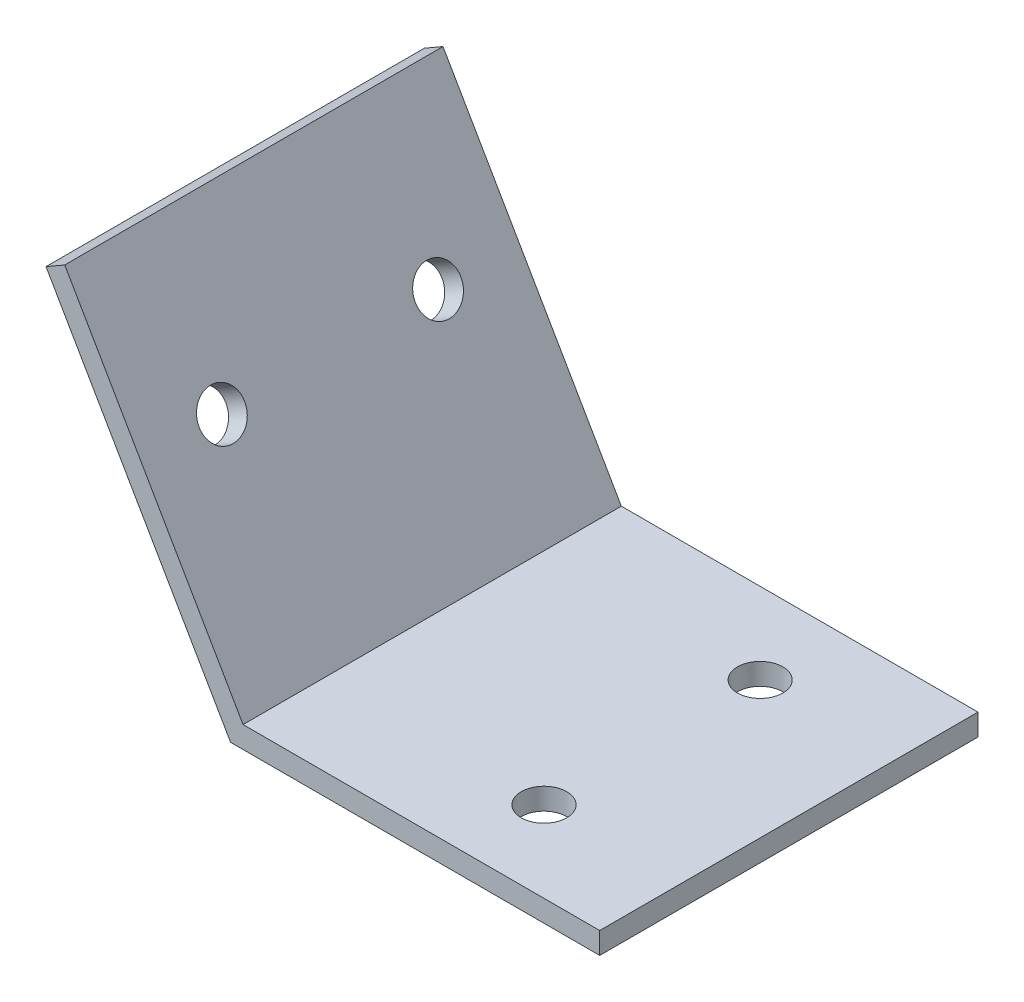
ISO-10303-21;
HEADER;
FILE_DESCRIPTION(('STEP AP214'),'2;1');
FILE_NAME('part.step','',(''),(''),'','','');
FILE_SCHEMA(('AUTOMOTIVE_DESIGN { 1 0 10303 214 1 1 1 1 }'));
ENDSEC;
DATA;
#1=APPLICATION_CONTEXT('core data for automotive mechanical design processes');
#2=APPLICATION_PROTOCOL_DEFINITION('international standard','automotive_design',2000,#1);
#3=PRODUCT_CONTEXT('',#1,'mechanical');
#4=PRODUCT('Part','Part','',(#3));
#5=PRODUCT_RELATED_PRODUCT_CATEGORY('part','',(#4));
#6=PRODUCT_DEFINITION_FORMATION('','',#4);
#7=PRODUCT_DEFINITION_CONTEXT('part definition',#1,'design');
#8=PRODUCT_DEFINITION('design','',#6,#7);
#9=PRODUCT_DEFINITION_SHAPE('','',#8);
#10=(LENGTH_UNIT() NAMED_UNIT(*) SI_UNIT(.MILLI.,.METRE.));
#11=(NAMED_UNIT(*) PLANE_ANGLE_UNIT() SI_UNIT($,.RADIAN.));
#12=(NAMED_UNIT(*) SI_UNIT($,.STERADIAN.) SOLID_ANGLE_UNIT());
#13=UNCERTAINTY_MEASURE_WITH_UNIT(LENGTH_MEASURE(1.E-05),#10,'distance_accuracy_value','');
#14=(GEOMETRIC_REPRESENTATION_CONTEXT(3) GLOBAL_UNCERTAINTY_ASSIGNED_CONTEXT((#13)) GLOBAL_UNIT_ASSIGNED_CONTEXT((#10,
#11,#12)) REPRESENTATION_CONTEXT('',''));
#15=CARTESIAN_POINT('',(0.,0.,0.));
#16=DIRECTION('',(0.,0.,1.));
#17=DIRECTION('',(1.,0.,0.));
#18=AXIS2_PLACEMENT_3D('',#15,#16,#17);
#19=CARTESIAN_POINT('',(-17.0773502691896,29.5788383248865,35.));
#20=DIRECTION('',(0.86602540378444,0.499999999999998,0.));
#21=DIRECTION('',(-0.499999999999998,0.86602540378444,0.));
#22=AXIS2_PLACEMENT_3D('',#19,#20,#21);
#23=PLANE('',#22);
#24=CARTESIAN_POINT('',(-10.035,17.3811298539537,27.5));
#25=DIRECTION('',(-0.86602540378444,-0.499999999999998,0.));
#26=DIRECTION('',(0.499999999999998,-0.86602540378444,0.));
#27=AXIS2_PLACEMENT_3D('',#24,#25,#26);
#28=CIRCLE('',#27,2.1);
#29=CARTESIAN_POINT('',(-8.98499999999996,15.5624765060064,27.5));
#30=VERTEX_POINT('',#29);
#31=EDGE_CURVE('E149',#30,#30,#28,.T.);
#32=ORIENTED_EDGE('',*,*,#31,.F.);
#33=EDGE_LOOP('',(#32));
#34=FACE_BOUND('',#33,.T.);
#35=CARTESIAN_POINT('',(-10.035,17.3811298539537,7.5));
#36=DIRECTION('',(-0.86602540378444,-0.499999999999998,0.));
#37=DIRECTION('',(-0.499999999999998,0.86602540378444,0.));
#38=AXIS2_PLACEMENT_3D('',#35,#36,#37);
#39=CIRCLE('',#38,2.1);
#40=CARTESIAN_POINT('',(-8.98499999999996,15.5624765060064,7.5));
#41=VERTEX_POINT('',#40);
#42=EDGE_CURVE('E155',#41,#41,#39,.T.);
#43=ORIENTED_EDGE('',*,*,#42,.F.);
#44=EDGE_LOOP('',(#43));
#45=FACE_BOUND('',#44,.T.);
#46=DIRECTION('',(0.499999999999998,-0.86602540378444,0.));
#47=VECTOR('',#46,1.);
#48=CARTESIAN_POINT('',(-17.0773502691896,29.5788383248865,0.));
#49=LINE('',#48,#47);
#50=CARTESIAN_POINT('',(-17.0773502691896,29.5788383248865,0.));
#51=VERTEX_POINT('',#50);
#52=CARTESIAN_POINT('',(0.,0.,0.));
#53=VERTEX_POINT('',#52);
#54=EDGE_CURVE('E125',#51,#53,#49,.T.);
#55=ORIENTED_EDGE('',*,*,#54,.T.);
#56=DIRECTION('',(0.,0.,-1.));
#57=VECTOR('',#56,1.);
#58=CARTESIAN_POINT('',(0.,0.,35.));
#59=LINE('',#58,#57);
#60=CARTESIAN_POINT('',(0.,0.,35.));
#61=VERTEX_POINT('',#60);
#62=EDGE_CURVE('E11',#61,#53,#59,.T.);
#63=ORIENTED_EDGE('',*,*,#62,.F.);
#64=DIRECTION('',(0.499999999999998,-0.86602540378444,0.));
#65=VECTOR('',#64,1.);
#66=CARTESIAN_POINT('',(-17.0773502691896,29.5788383248865,35.));
#67=LINE('',#66,#65);
#68=CARTESIAN_POINT('',(-17.0773502691896,29.5788383248865,35.));
#69=VERTEX_POINT('',#68);
#70=EDGE_CURVE('E136',#69,#61,#67,.T.);
#71=ORIENTED_EDGE('',*,*,#70,.F.);
#72=DIRECTION('',(0.,0.,-1.));
#73=VECTOR('',#72,1.);
#74=CARTESIAN_POINT('',(-17.0773502691896,29.5788383248865,35.));
#75=LINE('',#74,#73);
#76=EDGE_CURVE('E121',#69,#51,#75,.T.);
#77=ORIENTED_EDGE('',*,*,#76,.T.);
#78=EDGE_LOOP('',(#55,#63,#71,#77));
#79=FACE_BOUND('',#78,.T.);
#80=ADVANCED_FACE('F39',(#34,#45,#79),#23,.F.);
#81=CARTESIAN_POINT('',(0.,0.,35.));
#82=DIRECTION('',(0.,1.,0.));
#83=DIRECTION('',(-1.,0.,0.));
#84=AXIS2_PLACEMENT_3D('',#81,#82,#83);
#85=PLANE('',#84);
#86=CARTESIAN_POINT('',(21.5,0.,27.5));
#87=DIRECTION('',(0.,-1.,0.));
#88=DIRECTION('',(1.,0.,0.));
#89=AXIS2_PLACEMENT_3D('',#86,#87,#88);
#90=CIRCLE('',#89,2.1);
#91=CARTESIAN_POINT('',(23.6,0.,27.5));
#92=VERTEX_POINT('',#91);
#93=EDGE_CURVE('E145',#92,#92,#90,.T.);
#94=ORIENTED_EDGE('',*,*,#93,.F.);
#95=EDGE_LOOP('',(#94));
#96=FACE_BOUND('',#95,.T.);
#97=CARTESIAN_POINT('',(21.5,0.,7.50000000000001));
#98=DIRECTION('',(0.,-1.,0.));
#99=DIRECTION('',(-1.,0.,0.));
#100=AXIS2_PLACEMENT_3D('',#97,#98,#99);
#101=CIRCLE('',#100,2.1);
#102=CARTESIAN_POINT('',(19.4,0.,7.50000000000001));
#103=VERTEX_POINT('',#102);
#104=EDGE_CURVE('E153',#103,#103,#101,.T.);
#105=ORIENTED_EDGE('',*,*,#104,.F.);
#106=EDGE_LOOP('',(#105));
#107=FACE_BOUND('',#106,.T.);
#108=DIRECTION('',(1.,0.,0.));
#109=VECTOR('',#108,1.);
#110=CARTESIAN_POINT('',(0.,0.,0.));
#111=LINE('',#110,#109);
#112=CARTESIAN_POINT('',(34.1547005383792,0.,0.));
#113=VERTEX_POINT('',#112);
#114=EDGE_CURVE('E128',#53,#113,#111,.T.);
#115=ORIENTED_EDGE('',*,*,#114,.T.);
#116=DIRECTION('',(0.,0.,-1.));
#117=VECTOR('',#116,1.);
#118=CARTESIAN_POINT('',(34.1547005383792,0.,35.));
#119=LINE('',#118,#117);
#120=CARTESIAN_POINT('',(34.1547005383792,0.,35.));
#121=VERTEX_POINT('',#120);
#122=EDGE_CURVE('E48',#121,#113,#119,.T.);
#123=ORIENTED_EDGE('',*,*,#122,.F.);
#124=DIRECTION('',(1.,0.,0.));
#125=VECTOR('',#124,1.);
#126=CARTESIAN_POINT('',(0.,0.,35.));
#127=LINE('',#126,#125);
#128=EDGE_CURVE('E94',#61,#121,#127,.T.);
#129=ORIENTED_EDGE('',*,*,#128,.F.);
#130=ORIENTED_EDGE('',*,*,#62,.T.);
#131=EDGE_LOOP('',(#115,#123,#129,#130));
#132=FACE_BOUND('',#131,.T.);
#133=ADVANCED_FACE('F169',(#96,#107,#132),#85,.F.);
#134=CARTESIAN_POINT('',(34.1547005383792,0.,35.));
#135=DIRECTION('',(-1.,0.,0.));
#136=DIRECTION('',(0.,0.,1.));
#137=AXIS2_PLACEMENT_3D('',#134,#135,#136);
#138=PLANE('',#137);
#139=DIRECTION('',(0.,1.,0.));
#140=VECTOR('',#139,1.);
#141=CARTESIAN_POINT('',(34.1547005383792,0.,0.));
#142=LINE('',#141,#140);
#143=CARTESIAN_POINT('',(34.1547005383792,2.,0.));
#144=VERTEX_POINT('',#143);
#145=EDGE_CURVE('E131',#113,#144,#142,.T.);
#146=ORIENTED_EDGE('',*,*,#145,.T.);
#147=DIRECTION('',(0.,0.,-1.));
#148=VECTOR('',#147,1.);
#149=CARTESIAN_POINT('',(34.1547005383792,2.,35.));
#150=LINE('',#149,#148);
#151=CARTESIAN_POINT('',(34.1547005383792,2.,35.));
#152=VERTEX_POINT('',#151);
#153=EDGE_CURVE('E116',#152,#144,#150,.T.);
#154=ORIENTED_EDGE('',*,*,#153,.F.);
#155=DIRECTION('',(0.,1.,0.));
#156=VECTOR('',#155,1.);
#157=CARTESIAN_POINT('',(34.1547005383792,0.,35.));
#158=LINE('',#157,#156);
#159=EDGE_CURVE('E107',#121,#152,#158,.T.);
#160=ORIENTED_EDGE('',*,*,#159,.F.);
#161=ORIENTED_EDGE('',*,*,#122,.T.);
#162=EDGE_LOOP('',(#146,#154,#160,#161));
#163=FACE_BOUND('',#162,.T.);
#164=ADVANCED_FACE('F172',(#163),#138,.F.);
#165=CARTESIAN_POINT('',(34.1547005383792,2.,35.));
#166=DIRECTION('',(0.,-1.,0.));
#167=DIRECTION('',(1.,0.,0.));
#168=AXIS2_PLACEMENT_3D('',#165,#166,#167);
#169=PLANE('',#168);
#170=CARTESIAN_POINT('',(21.5,2.,27.5));
#171=DIRECTION('',(0.,-1.,0.));
#172=DIRECTION('',(1.,0.,0.));
#173=AXIS2_PLACEMENT_3D('',#170,#171,#172);
#174=CIRCLE('',#173,2.1);
#175=CARTESIAN_POINT('',(23.6,2.,27.5));
#176=VERTEX_POINT('',#175);
#177=EDGE_CURVE('E129',#176,#176,#174,.T.);
#178=ORIENTED_EDGE('',*,*,#177,.T.);
#179=EDGE_LOOP('',(#178));
#180=FACE_BOUND('',#179,.T.);
#181=CARTESIAN_POINT('',(21.5,2.,7.50000000000001));
#182=DIRECTION('',(0.,-1.,0.));
#183=DIRECTION('',(1.,0.,0.));
#184=AXIS2_PLACEMENT_3D('',#181,#182,#183);
#185=CIRCLE('',#184,2.1);
#186=CARTESIAN_POINT('',(23.6,2.,7.50000000000001));
#187=VERTEX_POINT('',#186);
#188=EDGE_CURVE('E142',#187,#187,#185,.T.);
#189=ORIENTED_EDGE('',*,*,#188,.T.);
#190=EDGE_LOOP('',(#189));
#191=FACE_BOUND('',#190,.T.);
#192=DIRECTION('',(-1.,0.,0.));
#193=VECTOR('',#192,1.);
#194=CARTESIAN_POINT('',(34.1547005383792,2.,0.));
#195=LINE('',#194,#193);
#196=CARTESIAN_POINT('',(1.15470053837926,2.,0.));
#197=VERTEX_POINT('',#196);
#198=EDGE_CURVE('E115',#144,#197,#195,.T.);
#199=ORIENTED_EDGE('',*,*,#198,.T.);
#200=DIRECTION('',(0.,0.,-1.));
#201=VECTOR('',#200,1.);
#202=CARTESIAN_POINT('',(1.15470053837926,2.,35.));
#203=LINE('',#202,#201);
#204=CARTESIAN_POINT('',(1.15470053837926,2.,35.));
#205=VERTEX_POINT('',#204);
#206=EDGE_CURVE('E112',#205,#197,#203,.T.);
#207=ORIENTED_EDGE('',*,*,#206,.F.);
#208=DIRECTION('',(-1.,0.,0.));
#209=VECTOR('',#208,1.);
#210=CARTESIAN_POINT('',(34.1547005383792,2.,35.));
#211=LINE('',#210,#209);
#212=EDGE_CURVE('E101',#152,#205,#211,.T.);
#213=ORIENTED_EDGE('',*,*,#212,.F.);
#214=ORIENTED_EDGE('',*,*,#153,.T.);
#215=EDGE_LOOP('',(#199,#207,#213,#214));
#216=FACE_BOUND('',#215,.T.);
#217=ADVANCED_FACE('F113',(#180,#191,#216),#169,.F.);
#218=CARTESIAN_POINT('',(1.15470053837926,2.,35.));
#219=DIRECTION('',(-0.86602540378444,-0.499999999999998,0.));
#220=DIRECTION('',(0.499999999999998,-0.86602540378444,0.));
#221=AXIS2_PLACEMENT_3D('',#218,#219,#220);
#222=PLANE('',#221);
#223=CARTESIAN_POINT('',(-8.30294919243108,18.3811298539537,27.5));
#224=DIRECTION('',(-0.86602540378444,-0.499999999999998,0.));
#225=DIRECTION('',(0.499999999999998,-0.86602540378444,0.));
#226=AXIS2_PLACEMENT_3D('',#223,#224,#225);
#227=CIRCLE('',#226,2.1);
#228=CARTESIAN_POINT('',(-7.25294919243109,16.5624765060064,27.5));
#229=VERTEX_POINT('',#228);
#230=EDGE_CURVE('E42',#229,#229,#227,.T.);
#231=ORIENTED_EDGE('',*,*,#230,.T.);
#232=EDGE_LOOP('',(#231));
#233=FACE_BOUND('',#232,.T.);
#234=CARTESIAN_POINT('',(-8.30294919243108,18.3811298539537,7.5));
#235=DIRECTION('',(-0.86602540378444,-0.499999999999998,0.));
#236=DIRECTION('',(0.499999999999998,-0.86602540378444,0.));
#237=AXIS2_PLACEMENT_3D('',#234,#235,#236);
#238=CIRCLE('',#237,2.1);
#239=CARTESIAN_POINT('',(-7.25294919243109,16.5624765060064,7.5));
#240=VERTEX_POINT('',#239);
#241=EDGE_CURVE('E147',#240,#240,#238,.T.);
#242=ORIENTED_EDGE('',*,*,#241,.T.);
#243=EDGE_LOOP('',(#242));
#244=FACE_BOUND('',#243,.T.);
#245=DIRECTION('',(-0.499999999999998,0.86602540378444,0.));
#246=VECTOR('',#245,1.);
#247=CARTESIAN_POINT('',(1.15470053837926,2.,0.));
#248=LINE('',#247,#246);
#249=CARTESIAN_POINT('',(-15.3452994616207,30.5788383248865,0.));
#250=VERTEX_POINT('',#249);
#251=EDGE_CURVE('E80',#197,#250,#248,.T.);
#252=ORIENTED_EDGE('',*,*,#251,.T.);
#253=DIRECTION('',(0.,0.,-1.));
#254=VECTOR('',#253,1.);
#255=CARTESIAN_POINT('',(-15.3452994616207,30.5788383248865,35.));
#256=LINE('',#255,#254);
#257=CARTESIAN_POINT('',(-15.3452994616207,30.5788383248865,35.));
#258=VERTEX_POINT('',#257);
#259=EDGE_CURVE('E117',#258,#250,#256,.T.);
#260=ORIENTED_EDGE('',*,*,#259,.F.);
#261=DIRECTION('',(-0.499999999999998,0.86602540378444,0.));
#262=VECTOR('',#261,1.);
#263=CARTESIAN_POINT('',(1.15470053837926,2.,35.));
#264=LINE('',#263,#262);
#265=EDGE_CURVE('E105',#205,#258,#264,.T.);
#266=ORIENTED_EDGE('',*,*,#265,.F.);
#267=ORIENTED_EDGE('',*,*,#206,.T.);
#268=EDGE_LOOP('',(#252,#260,#266,#267));
#269=FACE_BOUND('',#268,.T.);
#270=ADVANCED_FACE('F119',(#233,#244,#269),#222,.F.);
#271=CARTESIAN_POINT('',(-15.3452994616207,30.5788383248865,35.));
#272=DIRECTION('',(0.499999999999998,-0.86602540378444,0.));
#273=DIRECTION('',(0.86602540378444,0.499999999999998,0.));
#274=AXIS2_PLACEMENT_3D('',#271,#272,#273);
#275=PLANE('',#274);
#276=DIRECTION('',(-0.86602540378444,-0.499999999999998,0.));
#277=VECTOR('',#276,1.);
#278=CARTESIAN_POINT('',(-15.3452994616207,30.5788383248865,0.));
#279=LINE('',#278,#277);
#280=EDGE_CURVE('E86',#250,#51,#279,.T.);
#281=ORIENTED_EDGE('',*,*,#280,.T.);
#282=ORIENTED_EDGE('',*,*,#76,.F.);
#283=DIRECTION('',(-0.86602540378444,-0.499999999999998,0.));
#284=VECTOR('',#283,1.);
#285=CARTESIAN_POINT('',(-15.3452994616207,30.5788383248865,35.));
#286=LINE('',#285,#284);
#287=EDGE_CURVE('E57',#258,#69,#286,.T.);
#288=ORIENTED_EDGE('',*,*,#287,.F.);
#289=ORIENTED_EDGE('',*,*,#259,.T.);
#290=EDGE_LOOP('',(#281,#282,#288,#289));
#291=FACE_BOUND('',#290,.T.);
#292=ADVANCED_FACE('F177',(#291),#275,.F.);
#293=CARTESIAN_POINT('',(0.,0.,35.));
#294=DIRECTION('',(0.,0.,-1.));
#295=DIRECTION('',(-1.,0.,0.));
#296=AXIS2_PLACEMENT_3D('',#293,#294,#295);
#297=PLANE('',#296);
#298=ORIENTED_EDGE('',*,*,#70,.T.);
#299=ORIENTED_EDGE('',*,*,#128,.T.);
#300=ORIENTED_EDGE('',*,*,#159,.T.);
#301=ORIENTED_EDGE('',*,*,#212,.T.);
#302=ORIENTED_EDGE('',*,*,#265,.T.);
#303=ORIENTED_EDGE('',*,*,#287,.T.);
#304=EDGE_LOOP('',(#298,#299,#300,#301,#302,#303));
#305=FACE_BOUND('',#304,.T.);
#306=ADVANCED_FACE('F103',(#305),#297,.F.);
#307=CARTESIAN_POINT('',(0.,0.,0.));
#308=DIRECTION('',(0.,0.,-1.));
#309=DIRECTION('',(-1.,0.,0.));
#310=AXIS2_PLACEMENT_3D('',#307,#308,#309);
#311=PLANE('',#310);
#312=ORIENTED_EDGE('',*,*,#54,.F.);
#313=ORIENTED_EDGE('',*,*,#280,.F.);
#314=ORIENTED_EDGE('',*,*,#251,.F.);
#315=ORIENTED_EDGE('',*,*,#198,.F.);
#316=ORIENTED_EDGE('',*,*,#145,.F.);
#317=ORIENTED_EDGE('',*,*,#114,.F.);
#318=EDGE_LOOP('',(#312,#313,#314,#315,#316,#317));
#319=FACE_BOUND('',#318,.T.);
#320=ADVANCED_FACE('F175',(#319),#311,.T.);
#321=CARTESIAN_POINT('',(21.5,30.5788383248865,7.50000000000001));
#322=DIRECTION('',(0.,-1.,0.));
#323=DIRECTION('',(1.,0.,0.));
#324=AXIS2_PLACEMENT_3D('',#321,#322,#323);
#325=CYLINDRICAL_SURFACE('',#324,2.1);
#326=ORIENTED_EDGE('',*,*,#104,.T.);
#327=EDGE_LOOP('',(#326));
#328=FACE_BOUND('',#327,.T.);
#329=ORIENTED_EDGE('',*,*,#188,.F.);
#330=EDGE_LOOP('',(#329));
#331=FACE_BOUND('',#330,.T.);
#332=ADVANCED_FACE('F209',(#328,#331),#325,.F.);
#333=CARTESIAN_POINT('',(21.5,30.5788383248865,27.5));
#334=DIRECTION('',(0.,-1.,0.));
#335=DIRECTION('',(1.,0.,0.));
#336=AXIS2_PLACEMENT_3D('',#333,#334,#335);
#337=CYLINDRICAL_SURFACE('',#336,2.1);
#338=ORIENTED_EDGE('',*,*,#93,.T.);
#339=EDGE_LOOP('',(#338));
#340=FACE_BOUND('',#339,.T.);
#341=ORIENTED_EDGE('',*,*,#177,.F.);
#342=EDGE_LOOP('',(#341));
#343=FACE_BOUND('',#342,.T.);
#344=ADVANCED_FACE('F203',(#340,#343),#337,.F.);
#345=CARTESIAN_POINT('',(28.8220508075689,39.8152585976185,7.5));
#346=DIRECTION('',(-0.86602540378444,-0.499999999999998,0.));
#347=DIRECTION('',(0.499999999999998,-0.86602540378444,0.));
#348=AXIS2_PLACEMENT_3D('',#345,#346,#347);
#349=CYLINDRICAL_SURFACE('',#348,2.1);
#350=CARTESIAN_POINT('',(-8.98499999999996,15.5624765060064,7.5));
#351=CARTESIAN_POINT('',(-8.96695780408778,15.5728931726731,7.5));
#352=CARTESIAN_POINT('',(-8.94891560817561,15.5833098393397,7.5));
#353=CARTESIAN_POINT('',(-8.91283121635125,15.6041431726731,7.5));
#354=CARTESIAN_POINT('',(-8.89478902043908,15.6145598393397,7.5));
#355=CARTESIAN_POINT('',(-8.85870462861473,15.635393172673,7.5));
#356=CARTESIAN_POINT('',(-8.84066243270255,15.6458098393397,7.5));
#357=CARTESIAN_POINT('',(-8.8045780408782,15.666643172673,7.5));
#358=CARTESIAN_POINT('',(-8.78653584496602,15.6770598393397,7.5));
#359=CARTESIAN_POINT('',(-8.75045145314167,15.697893172673,7.5));
#360=CARTESIAN_POINT('',(-8.7324092572295,15.7083098393397,7.5));
#361=CARTESIAN_POINT('',(-8.69632486540514,15.729143172673,7.5));
#362=CARTESIAN_POINT('',(-8.67828266949297,15.7395598393397,7.5));
#363=CARTESIAN_POINT('',(-8.64219827766862,15.760393172673,7.5));
#364=CARTESIAN_POINT('',(-8.62415608175644,15.7708098393397,7.5));
#365=CARTESIAN_POINT('',(-8.58807168993209,15.791643172673,7.5));
#366=CARTESIAN_POINT('',(-8.57002949401991,15.8020598393397,7.5));
#367=CARTESIAN_POINT('',(-8.53394510219556,15.822893172673,7.5));
#368=CARTESIAN_POINT('',(-8.51590290628339,15.8333098393397,7.5));
#369=CARTESIAN_POINT('',(-8.47981851445904,15.854143172673,7.5));
#370=CARTESIAN_POINT('',(-8.46177631854687,15.8645598393397,7.5));
#371=CARTESIAN_POINT('',(-8.42569192672251,15.885393172673,7.5));
#372=CARTESIAN_POINT('',(-8.40764973081034,15.8958098393397,7.5));
#373=CARTESIAN_POINT('',(-8.37156533898598,15.916643172673,7.5));
#374=CARTESIAN_POINT('',(-8.35352314307381,15.9270598393397,7.5));
#375=CARTESIAN_POINT('',(-8.31743875124946,15.947893172673,7.5));
#376=CARTESIAN_POINT('',(-8.29939655533728,15.9583098393397,7.5));
#377=CARTESIAN_POINT('',(-8.26331216351293,15.979143172673,7.5));
#378=CARTESIAN_POINT('',(-8.24526996760075,15.9895598393397,7.5));
#379=CARTESIAN_POINT('',(-8.2091855757764,16.010393172673,7.5));
#380=CARTESIAN_POINT('',(-8.19114337986423,16.0208098393397,7.5));
#381=CARTESIAN_POINT('',(-8.15505898803987,16.041643172673,7.5));
#382=CARTESIAN_POINT('',(-8.1370167921277,16.0520598393397,7.5));
#383=CARTESIAN_POINT('',(-8.10093240030335,16.072893172673,7.5));
#384=CARTESIAN_POINT('',(-8.08289020439117,16.0833098393397,7.5));
#385=CARTESIAN_POINT('',(-8.04680581256682,16.104143172673,7.5));
#386=CARTESIAN_POINT('',(-8.02876361665464,16.1145598393397,7.5));
#387=CARTESIAN_POINT('',(-7.99267922483029,16.135393172673,7.5));
#388=CARTESIAN_POINT('',(-7.97463702891812,16.1458098393397,7.5));
#389=CARTESIAN_POINT('',(-7.93855263709376,16.166643172673,7.5));
#390=CARTESIAN_POINT('',(-7.92051044118159,16.1770598393397,7.5));
#391=CARTESIAN_POINT('',(-7.88442604935724,16.197893172673,7.5));
#392=CARTESIAN_POINT('',(-7.86638385344506,16.2083098393397,7.5));
#393=CARTESIAN_POINT('',(-7.83029946162071,16.229143172673,7.5));
#394=CARTESIAN_POINT('',(-7.81225726570853,16.2395598393397,7.5));
#395=CARTESIAN_POINT('',(-7.77617287388418,16.260393172673,7.5));
#396=CARTESIAN_POINT('',(-7.758130677972,16.2708098393397,7.5));
#397=CARTESIAN_POINT('',(-7.72204628614765,16.291643172673,7.5));
#398=CARTESIAN_POINT('',(-7.70400409023548,16.3020598393397,7.5));
#399=CARTESIAN_POINT('',(-7.66791969841113,16.322893172673,7.5));
#400=CARTESIAN_POINT('',(-7.64987750249896,16.3333098393397,7.5));
#401=CARTESIAN_POINT('',(-7.6137931106746,16.354143172673,7.5));
#402=CARTESIAN_POINT('',(-7.59575091476243,16.3645598393397,7.5));
#403=CARTESIAN_POINT('',(-7.55966652293808,16.385393172673,7.5));
#404=CARTESIAN_POINT('',(-7.5416243270259,16.3958098393397,7.5));
#405=CARTESIAN_POINT('',(-7.50553993520155,16.416643172673,7.5));
#406=CARTESIAN_POINT('',(-7.48749773928937,16.4270598393397,7.5));
#407=CARTESIAN_POINT('',(-7.45141334746502,16.447893172673,7.5));
#408=CARTESIAN_POINT('',(-7.43337115155285,16.4583098393397,7.5));
#409=CARTESIAN_POINT('',(-7.39728675972849,16.479143172673,7.5));
#410=CARTESIAN_POINT('',(-7.37924456381632,16.4895598393397,7.5));
#411=CARTESIAN_POINT('',(-7.34316017199197,16.510393172673,7.5));
#412=CARTESIAN_POINT('',(-7.32511797607979,16.5208098393397,7.5));
#413=CARTESIAN_POINT('',(-7.28903358425544,16.541643172673,7.5));
#414=CARTESIAN_POINT('',(-7.27099138834326,16.5520598393397,7.5));
#415=CARTESIAN_POINT('',(-7.25294919243109,16.5624765060064,7.5));
#416=B_SPLINE_CURVE_WITH_KNOTS('',3,(#350,#351,#352,#353,#354,#355,#356,#357,#358,#359,#360,
#361,#362,#363,#364,#365,#366,#367,#368,#369,#370,#371,#372,#373,#374,#375,#376,#377,#378,#379,
#380,#381,#382,#383,#384,#385,#386,#387,#388,#389,#390,#391,#392,#393,#394,#395,#396,#397,#398,
#399,#400,#401,#402,#403,#404,#405,#406,#407,#408,#409,#410,#411,#412,#413,#414,#415),
.UNSPECIFIED.,.F.,.F.,(4,2,2,2,2,2,2,2,2,2,2,2,2,2,2,2,2,2,2,2,2,2,2,2,2,2,2,2,2,2,2,2,4),(0.,
0.0625000000000002,0.125,0.187500000000001,0.250000000000001,0.312500000000001,
0.375000000000001,0.437500000000002,0.500000000000002,0.562499999999995,0.624999999999995,
0.687499999999995,0.749999999999995,0.812499999999996,0.874999999999996,0.937499999999996,
0.999999999999996,1.0625,1.125,1.1875,1.25,1.3125,1.375,1.4375,1.49999999999999,
1.56249999999999,1.62499999999999,1.68749999999999,1.74999999999999,1.81249999999999,
1.87499999999999,1.93749999999999,1.99999999999999),.UNSPECIFIED.);
#417=EDGE_CURVE('BSEAM199',#41,#240,#416,.T.);
#418=ORIENTED_EDGE('',*,*,#42,.T.);
#419=ORIENTED_EDGE('',*,*,#241,.F.);
#420=ORIENTED_EDGE('',*,*,#417,.T.);
#421=ORIENTED_EDGE('',*,*,#417,.F.);
#422=EDGE_LOOP('',(#418,#420,#419,#421));
#423=FACE_BOUND('',#422,.T.);
#424=ADVANCED_FACE('F199',(#423),#349,.F.);
#425=CARTESIAN_POINT('',(28.8220508075689,39.8152585976185,27.5));
#426=DIRECTION('',(-0.86602540378444,-0.499999999999998,0.));
#427=DIRECTION('',(0.499999999999998,-0.86602540378444,0.));
#428=AXIS2_PLACEMENT_3D('',#425,#426,#427);
#429=CYLINDRICAL_SURFACE('',#428,2.1);
#430=CARTESIAN_POINT('',(-8.98499999999996,15.5624765060064,27.5));
#431=CARTESIAN_POINT('',(-8.96695780408778,15.5728931726731,27.5));
#432=CARTESIAN_POINT('',(-8.94891560817561,15.5833098393397,27.5));
#433=CARTESIAN_POINT('',(-8.91283121635125,15.6041431726731,27.5));
#434=CARTESIAN_POINT('',(-8.89478902043908,15.6145598393397,27.5));
#435=CARTESIAN_POINT('',(-8.85870462861473,15.635393172673,27.5));
#436=CARTESIAN_POINT('',(-8.84066243270255,15.6458098393397,27.5));
#437=CARTESIAN_POINT('',(-8.8045780408782,15.666643172673,27.5));
#438=CARTESIAN_POINT('',(-8.78653584496602,15.6770598393397,27.5));
#439=CARTESIAN_POINT('',(-8.75045145314167,15.697893172673,27.5));
#440=CARTESIAN_POINT('',(-8.7324092572295,15.7083098393397,27.5));
#441=CARTESIAN_POINT('',(-8.69632486540514,15.729143172673,27.5));
#442=CARTESIAN_POINT('',(-8.67828266949297,15.7395598393397,27.5));
#443=CARTESIAN_POINT('',(-8.64219827766862,15.760393172673,27.5));
#444=CARTESIAN_POINT('',(-8.62415608175644,15.7708098393397,27.5));
#445=CARTESIAN_POINT('',(-8.58807168993209,15.791643172673,27.5));
#446=CARTESIAN_POINT('',(-8.57002949401991,15.8020598393397,27.5));
#447=CARTESIAN_POINT('',(-8.53394510219556,15.822893172673,27.5));
#448=CARTESIAN_POINT('',(-8.51590290628339,15.8333098393397,27.5));
#449=CARTESIAN_POINT('',(-8.47981851445904,15.854143172673,27.5));
#450=CARTESIAN_POINT('',(-8.46177631854687,15.8645598393397,27.5));
#451=CARTESIAN_POINT('',(-8.42569192672251,15.885393172673,27.5));
#452=CARTESIAN_POINT('',(-8.40764973081034,15.8958098393397,27.5));
#453=CARTESIAN_POINT('',(-8.37156533898598,15.916643172673,27.5));
#454=CARTESIAN_POINT('',(-8.35352314307381,15.9270598393397,27.5));
#455=CARTESIAN_POINT('',(-8.31743875124946,15.947893172673,27.5));
#456=CARTESIAN_POINT('',(-8.29939655533728,15.9583098393397,27.5));
#457=CARTESIAN_POINT('',(-8.26331216351293,15.979143172673,27.5));
#458=CARTESIAN_POINT('',(-8.24526996760075,15.9895598393397,27.5));
#459=CARTESIAN_POINT('',(-8.2091855757764,16.010393172673,27.5));
#460=CARTESIAN_POINT('',(-8.19114337986423,16.0208098393397,27.5));
#461=CARTESIAN_POINT('',(-8.15505898803987,16.041643172673,27.5));
#462=CARTESIAN_POINT('',(-8.1370167921277,16.0520598393397,27.5));
#463=CARTESIAN_POINT('',(-8.10093240030335,16.072893172673,27.5));
#464=CARTESIAN_POINT('',(-8.08289020439117,16.0833098393397,27.5));
#465=CARTESIAN_POINT('',(-8.04680581256682,16.104143172673,27.5));
#466=CARTESIAN_POINT('',(-8.02876361665464,16.1145598393397,27.5));
#467=CARTESIAN_POINT('',(-7.99267922483029,16.135393172673,27.5));
#468=CARTESIAN_POINT('',(-7.97463702891812,16.1458098393397,27.5));
#469=CARTESIAN_POINT('',(-7.93855263709376,16.166643172673,27.5));
#470=CARTESIAN_POINT('',(-7.92051044118159,16.1770598393397,27.5));
#471=CARTESIAN_POINT('',(-7.88442604935724,16.197893172673,27.5));
#472=CARTESIAN_POINT('',(-7.86638385344506,16.2083098393397,27.5));
#473=CARTESIAN_POINT('',(-7.83029946162071,16.229143172673,27.5));
#474=CARTESIAN_POINT('',(-7.81225726570853,16.2395598393397,27.5));
#475=CARTESIAN_POINT('',(-7.77617287388418,16.260393172673,27.5));
#476=CARTESIAN_POINT('',(-7.758130677972,16.2708098393397,27.5));
#477=CARTESIAN_POINT('',(-7.72204628614765,16.291643172673,27.5));
#478=CARTESIAN_POINT('',(-7.70400409023548,16.3020598393397,27.5));
#479=CARTESIAN_POINT('',(-7.66791969841113,16.322893172673,27.5));
#480=CARTESIAN_POINT('',(-7.64987750249896,16.3333098393397,27.5));
#481=CARTESIAN_POINT('',(-7.6137931106746,16.354143172673,27.5));
#482=CARTESIAN_POINT('',(-7.59575091476243,16.3645598393397,27.5));
#483=CARTESIAN_POINT('',(-7.55966652293808,16.385393172673,27.5));
#484=CARTESIAN_POINT('',(-7.5416243270259,16.3958098393397,27.5));
#485=CARTESIAN_POINT('',(-7.50553993520155,16.416643172673,27.5));
#486=CARTESIAN_POINT('',(-7.48749773928937,16.4270598393397,27.5));
#487=CARTESIAN_POINT('',(-7.45141334746502,16.447893172673,27.5));
#488=CARTESIAN_POINT('',(-7.43337115155285,16.4583098393397,27.5));
#489=CARTESIAN_POINT('',(-7.39728675972849,16.479143172673,27.5));
#490=CARTESIAN_POINT('',(-7.37924456381632,16.4895598393397,27.5));
#491=CARTESIAN_POINT('',(-7.34316017199197,16.510393172673,27.5));
#492=CARTESIAN_POINT('',(-7.32511797607979,16.5208098393397,27.5));
#493=CARTESIAN_POINT('',(-7.28903358425544,16.541643172673,27.5));
#494=CARTESIAN_POINT('',(-7.27099138834326,16.5520598393397,27.5));
#495=CARTESIAN_POINT('',(-7.25294919243109,16.5624765060064,27.5));
#496=B_SPLINE_CURVE_WITH_KNOTS('',3,(#430,#431,#432,#433,#434,#435,#436,#437,#438,#439,#440,
#441,#442,#443,#444,#445,#446,#447,#448,#449,#450,#451,#452,#453,#454,#455,#456,#457,#458,#459,
#460,#461,#462,#463,#464,#465,#466,#467,#468,#469,#470,#471,#472,#473,#474,#475,#476,#477,#478,
#479,#480,#481,#482,#483,#484,#485,#486,#487,#488,#489,#490,#491,#492,#493,#494,#495),
.UNSPECIFIED.,.F.,.F.,(4,2,2,2,2,2,2,2,2,2,2,2,2,2,2,2,2,2,2,2,2,2,2,2,2,2,2,2,2,2,2,2,4),(0.,
0.0625000000000002,0.125,0.187500000000001,0.250000000000001,0.312500000000001,
0.375000000000001,0.437500000000002,0.500000000000002,0.562499999999995,0.624999999999995,
0.687499999999995,0.749999999999995,0.812499999999996,0.874999999999996,0.937499999999996,
0.999999999999996,1.0625,1.125,1.1875,1.25,1.3125,1.375,1.4375,1.49999999999999,
1.56249999999999,1.62499999999999,1.68749999999999,1.74999999999999,1.81249999999999,
1.87499999999999,1.93749999999999,1.99999999999999),.UNSPECIFIED.);
#497=EDGE_CURVE('BSEAM202',#30,#229,#496,.T.);
#498=ORIENTED_EDGE('',*,*,#31,.T.);
#499=ORIENTED_EDGE('',*,*,#230,.F.);
#500=ORIENTED_EDGE('',*,*,#497,.T.);
#501=ORIENTED_EDGE('',*,*,#497,.F.);
#502=EDGE_LOOP('',(#498,#500,#499,#501));
#503=FACE_BOUND('',#502,.T.);
#504=ADVANCED_FACE('F202',(#503),#429,.F.);
#505=CLOSED_SHELL('',(#80,#133,#164,#217,#270,#292,#306,#320,#332,#344,#424,#504));
#506=MANIFOLD_SOLID_BREP('B2',#505);
#507=ADVANCED_BREP_SHAPE_REPRESENTATION('',(#18,#506),#14);
#508=SHAPE_DEFINITION_REPRESENTATION(#9,#507);
ENDSEC;
END-ISO-10303-21;
